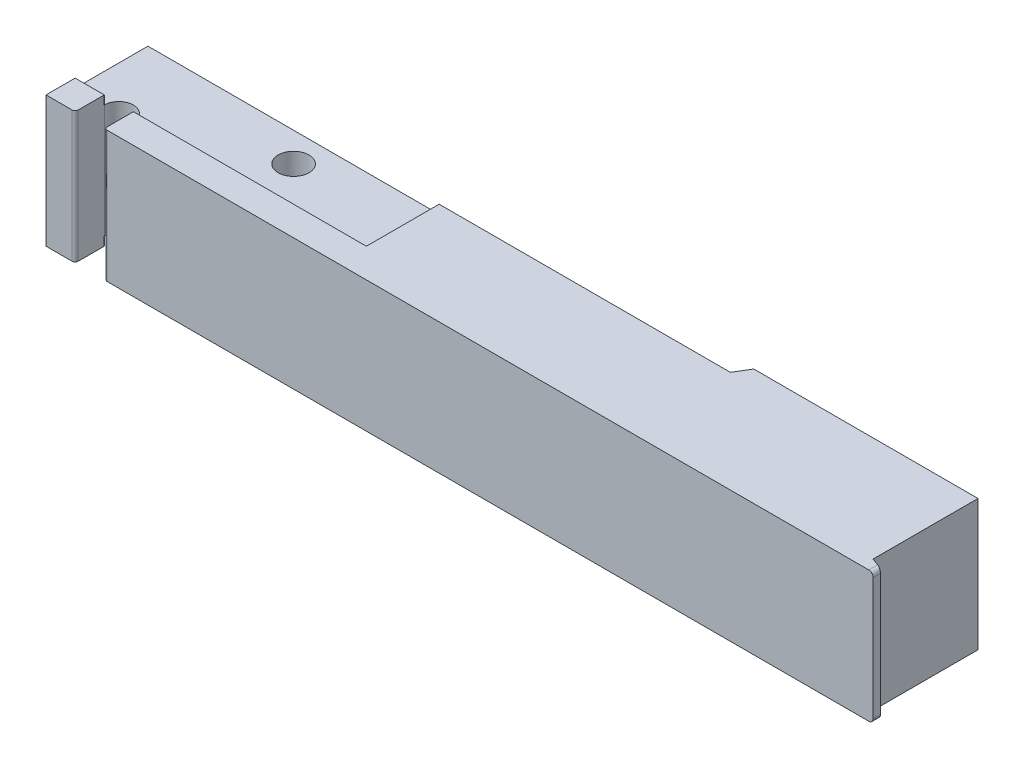
ISO-10303-21;
HEADER;
FILE_DESCRIPTION(('STEP AP214'),'2;1');
FILE_NAME('part.step','',(''),(''),'','','');
FILE_SCHEMA(('AUTOMOTIVE_DESIGN { 1 0 10303 214 1 1 1 1 }'));
ENDSEC;
DATA;
#1=APPLICATION_CONTEXT('core data for automotive mechanical design processes');
#2=APPLICATION_PROTOCOL_DEFINITION('international standard','automotive_design',2000,#1);
#3=PRODUCT_CONTEXT('',#1,'mechanical');
#4=PRODUCT('Part','Part','',(#3));
#5=PRODUCT_RELATED_PRODUCT_CATEGORY('part','',(#4));
#6=PRODUCT_DEFINITION_FORMATION('','',#4);
#7=PRODUCT_DEFINITION_CONTEXT('part definition',#1,'design');
#8=PRODUCT_DEFINITION('design','',#6,#7);
#9=PRODUCT_DEFINITION_SHAPE('','',#8);
#10=(LENGTH_UNIT() NAMED_UNIT(*) SI_UNIT(.MILLI.,.METRE.));
#11=(NAMED_UNIT(*) PLANE_ANGLE_UNIT() SI_UNIT($,.RADIAN.));
#12=(NAMED_UNIT(*) SI_UNIT($,.STERADIAN.) SOLID_ANGLE_UNIT());
#13=UNCERTAINTY_MEASURE_WITH_UNIT(LENGTH_MEASURE(1.E-05),#10,'distance_accuracy_value','');
#14=(GEOMETRIC_REPRESENTATION_CONTEXT(3) GLOBAL_UNCERTAINTY_ASSIGNED_CONTEXT((#13)) GLOBAL_UNIT_ASSIGNED_CONTEXT((#10,
#11,#12)) REPRESENTATION_CONTEXT('',''));
#15=CARTESIAN_POINT('',(0.,0.,0.));
#16=DIRECTION('',(0.,0.,1.));
#17=DIRECTION('',(1.,0.,0.));
#18=AXIS2_PLACEMENT_3D('',#15,#16,#17);
#19=CARTESIAN_POINT('',(12.6823074173348,-18.3135783689384,27.2138309190122));
#20=DIRECTION('',(0.,1.,0.));
#21=DIRECTION('',(-1.,0.,0.));
#22=AXIS2_PLACEMENT_3D('',#19,#20,#21);
#23=CYLINDRICAL_SURFACE('',#22,2.65);
#24=CARTESIAN_POINT('',(12.6823074173348,2.68742163106165,27.2138309190122));
#25=DIRECTION('',(0.,1.,0.));
#26=DIRECTION('',(-1.,0.,0.));
#27=AXIS2_PLACEMENT_3D('',#24,#25,#26);
#28=CIRCLE('',#27,2.65);
#29=CARTESIAN_POINT('',(10.0323074173348,2.68742163106165,27.2138309190122));
#30=VERTEX_POINT('',#29);
#31=EDGE_CURVE('E642',#30,#30,#28,.F.);
#32=ORIENTED_EDGE('',*,*,#31,.F.);
#33=EDGE_LOOP('',(#32));
#34=FACE_BOUND('',#33,.T.);
#35=CARTESIAN_POINT('',(12.6823074173348,-16.8125783689383,27.2138309190122));
#36=DIRECTION('',(0.,-1.,0.));
#37=DIRECTION('',(1.,0.,0.));
#38=AXIS2_PLACEMENT_3D('',#35,#36,#37);
#39=CIRCLE('',#38,2.65);
#40=CARTESIAN_POINT('',(15.3323074173348,-16.8125783689383,27.2138309190122));
#41=VERTEX_POINT('',#40);
#42=EDGE_CURVE('E681',#41,#41,#39,.F.);
#43=ORIENTED_EDGE('',*,*,#42,.F.);
#44=EDGE_LOOP('',(#43));
#45=FACE_BOUND('',#44,.T.);
#46=ADVANCED_FACE('F50',(#34,#45),#23,.F.);
#47=CARTESIAN_POINT('',(-9.81769258266516,-18.3135783689384,34.7138309190122));
#48=DIRECTION('',(0.,1.,0.));
#49=DIRECTION('',(-1.,0.,0.));
#50=AXIS2_PLACEMENT_3D('',#47,#48,#49);
#51=CYLINDRICAL_SURFACE('',#50,2.5);
#52=CARTESIAN_POINT('',(-9.81769258266516,-16.8125783689383,34.7138309190122));
#53=DIRECTION('',(0.,-1.,0.));
#54=DIRECTION('',(1.,0.,0.));
#55=AXIS2_PLACEMENT_3D('',#52,#53,#54);
#56=CIRCLE('',#55,2.5);
#57=CARTESIAN_POINT('',(-7.31769258266516,-16.8125783689383,34.7138309190122));
#58=VERTEX_POINT('',#57);
#59=CARTESIAN_POINT('',(-12.3176925826652,-16.8125783689383,34.7138309190122));
#60=VERTEX_POINT('',#59);
#61=EDGE_CURVE('E673',#58,#60,#56,.F.);
#62=ORIENTED_EDGE('',*,*,#61,.F.);
#63=DIRECTION('',(0.,1.,0.));
#64=VECTOR('',#63,1.);
#65=CARTESIAN_POINT('',(-7.31769258266516,-18.3135783689384,34.7138309190122));
#66=LINE('',#65,#64);
#67=CARTESIAN_POINT('',(-7.31769258266517,2.68742163106165,34.7138309190122));
#68=VERTEX_POINT('',#67);
#69=EDGE_CURVE('E66',#58,#68,#66,.T.);
#70=ORIENTED_EDGE('',*,*,#69,.T.);
#71=CARTESIAN_POINT('',(-9.81769258266516,2.68742163106165,34.7138309190122));
#72=DIRECTION('',(0.,1.,0.));
#73=DIRECTION('',(-1.,0.,0.));
#74=AXIS2_PLACEMENT_3D('',#71,#72,#73);
#75=CIRCLE('',#74,2.5);
#76=CARTESIAN_POINT('',(-12.3176925826652,2.68742163106165,34.7138309190122));
#77=VERTEX_POINT('',#76);
#78=EDGE_CURVE('E11',#77,#68,#75,.F.);
#79=ORIENTED_EDGE('',*,*,#78,.F.);
#80=DIRECTION('',(0.,1.,0.));
#81=VECTOR('',#80,1.);
#82=CARTESIAN_POINT('',(-12.3176925826652,-18.3135783689384,34.7138309190122));
#83=LINE('',#82,#81);
#84=EDGE_CURVE('E423',#60,#77,#83,.T.);
#85=ORIENTED_EDGE('',*,*,#84,.F.);
#86=EDGE_LOOP('',(#62,#70,#79,#85));
#87=FACE_BOUND('',#86,.T.);
#88=ADVANCED_FACE('F480',(#87),#51,.F.);
#89=CARTESIAN_POINT('',(-17.3176925826652,-18.3125783689383,19.7138309190122));
#90=DIRECTION('',(0.,-1.,0.));
#91=DIRECTION('',(1.,0.,0.));
#92=AXIS2_PLACEMENT_3D('',#89,#90,#91);
#93=PLANE('',#92);
#94=DIRECTION('',(0.,0.,1.));
#95=VECTOR('',#94,1.);
#96=CARTESIAN_POINT('',(-17.3176925826652,-18.3125783689383,19.7138309190122));
#97=LINE('',#96,#95);
#98=CARTESIAN_POINT('',(-17.3176925826652,-18.3125783689383,34.7138309190122));
#99=VERTEX_POINT('',#98);
#100=CARTESIAN_POINT('',(-17.3176925826652,-18.3125783689383,39.7138309190122));
#101=VERTEX_POINT('',#100);
#102=EDGE_CURVE('E286',#99,#101,#97,.T.);
#103=ORIENTED_EDGE('',*,*,#102,.F.);
#104=DIRECTION('',(1.,0.,0.));
#105=VECTOR('',#104,1.);
#106=CARTESIAN_POINT('',(-17.3176925826652,-18.3125783689383,34.7138309190122));
#107=LINE('',#106,#105);
#108=CARTESIAN_POINT('',(-12.3176925826652,-18.3125783689383,34.7138309190122));
#109=VERTEX_POINT('',#108);
#110=EDGE_CURVE('E228',#99,#109,#107,.T.);
#111=ORIENTED_EDGE('',*,*,#110,.T.);
#112=DIRECTION('',(0.,0.,-1.));
#113=VECTOR('',#112,1.);
#114=CARTESIAN_POINT('',(-12.3176925826652,-18.3125783689383,39.7138309190122));
#115=LINE('',#114,#113);
#116=CARTESIAN_POINT('',(-12.3176925826652,-18.3125783689383,39.2138309190122));
#117=VERTEX_POINT('',#116);
#118=EDGE_CURVE('E418',#117,#109,#115,.T.);
#119=ORIENTED_EDGE('',*,*,#118,.F.);
#120=CARTESIAN_POINT('',(-12.8176925826652,-18.3125783689383,39.2138309190122));
#121=DIRECTION('',(0.,-1.,0.));
#122=DIRECTION('',(1.,0.,0.));
#123=AXIS2_PLACEMENT_3D('',#120,#121,#122);
#124=CIRCLE('',#123,0.5);
#125=CARTESIAN_POINT('',(-12.8176925826652,-18.3125783689383,39.7138309190122));
#126=VERTEX_POINT('',#125);
#127=EDGE_CURVE('E369',#117,#126,#124,.T.);
#128=ORIENTED_EDGE('',*,*,#127,.T.);
#129=DIRECTION('',(1.,0.,0.));
#130=VECTOR('',#129,1.);
#131=CARTESIAN_POINT('',(-17.3176925826652,-18.3125783689383,39.7138309190122));
#132=LINE('',#131,#130);
#133=EDGE_CURVE('E283',#101,#126,#132,.T.);
#134=ORIENTED_EDGE('',*,*,#133,.F.);
#135=EDGE_LOOP('',(#103,#111,#119,#128,#134));
#136=FACE_BOUND('',#135,.T.);
#137=ADVANCED_FACE('F487',(#136),#93,.T.);
#138=DIRECTION('',(0.,0.,-1.));
#139=VECTOR('',#138,1.);
#140=CARTESIAN_POINT('',(-7.31769258266516,-18.3125783689383,39.7138309190122));
#141=LINE('',#140,#139);
#142=CARTESIAN_POINT('',(-7.31769258266516,-18.3125783689383,39.2138309190122));
#143=VERTEX_POINT('',#142);
#144=CARTESIAN_POINT('',(-7.31769258266516,-18.3125783689383,34.7138309190122));
#145=VERTEX_POINT('',#144);
#146=EDGE_CURVE('E404',#143,#145,#141,.T.);
#147=ORIENTED_EDGE('',*,*,#146,.T.);
#148=CARTESIAN_POINT('',(32.6823074173348,-18.3125783689383,34.7138309190122));
#149=VERTEX_POINT('',#148);
#150=EDGE_CURVE('E662',#145,#149,#107,.T.);
#151=ORIENTED_EDGE('',*,*,#150,.T.);
#152=DIRECTION('',(0.,0.,-1.));
#153=VECTOR('',#152,1.);
#154=CARTESIAN_POINT('',(32.6823074173348,-18.3125783689383,22.2138309190122));
#155=LINE('',#154,#153);
#156=CARTESIAN_POINT('',(32.6823074173348,-18.3125783689383,22.2138309190122));
#157=VERTEX_POINT('',#156);
#158=EDGE_CURVE('E666',#149,#157,#155,.T.);
#159=ORIENTED_EDGE('',*,*,#158,.T.);
#160=DIRECTION('',(1.,0.,0.));
#161=VECTOR('',#160,1.);
#162=CARTESIAN_POINT('',(82.6823074173348,-18.3125783689384,22.2138309190122));
#163=LINE('',#162,#161);
#164=CARTESIAN_POINT('',(82.6823074173348,-18.3125783689384,22.2138309190122));
#165=VERTEX_POINT('',#164);
#166=EDGE_CURVE('E435',#157,#165,#163,.T.);
#167=ORIENTED_EDGE('',*,*,#166,.T.);
#168=DIRECTION('',(0.514495755427527,0.,-0.857492925712544));
#169=VECTOR('',#168,1.);
#170=CARTESIAN_POINT('',(82.6823074173348,-18.3125783689384,22.2138309190122));
#171=LINE('',#170,#169);
#172=CARTESIAN_POINT('',(84.1823074173348,-18.3125783689384,19.7138309190122));
#173=VERTEX_POINT('',#172);
#174=EDGE_CURVE('E258',#165,#173,#171,.T.);
#175=ORIENTED_EDGE('',*,*,#174,.T.);
#176=DIRECTION('',(1.,0.,0.));
#177=VECTOR('',#176,1.);
#178=CARTESIAN_POINT('',(-17.3176925826652,-18.3125783689383,19.7138309190122));
#179=LINE('',#178,#177);
#180=CARTESIAN_POINT('',(122.682307417335,-18.3125783689383,19.7138309190122));
#181=VERTEX_POINT('',#180);
#182=EDGE_CURVE('E282',#173,#181,#179,.T.);
#183=ORIENTED_EDGE('',*,*,#182,.T.);
#184=DIRECTION('',(0.,0.,1.));
#185=VECTOR('',#184,1.);
#186=CARTESIAN_POINT('',(122.682307417335,-18.3125783689383,19.7138309190122));
#187=LINE('',#186,#185);
#188=CARTESIAN_POINT('',(122.682307417335,-18.3125783689383,37.7358904504798));
#189=VERTEX_POINT('',#188);
#190=EDGE_CURVE('E267',#181,#189,#187,.T.);
#191=ORIENTED_EDGE('',*,*,#190,.T.);
#192=DIRECTION('',(-0.939692620785909,0.,-0.342020143325667));
#193=VECTOR('',#192,1.);
#194=CARTESIAN_POINT('',(-6.73298188492406,-18.3125783689383,-9.3674227144914));
#195=LINE('',#194,#193);
#196=CARTESIAN_POINT('',(123.932307417335,-18.3125783689383,38.1908532433126));
#197=VERTEX_POINT('',#196);
#198=EDGE_CURVE('E315',#189,#197,#195,.F.);
#199=ORIENTED_EDGE('',*,*,#198,.T.);
#200=DIRECTION('',(0.,0.,1.));
#201=VECTOR('',#200,1.);
#202=CARTESIAN_POINT('',(123.932307417335,-18.3125783689383,19.7138309190122));
#203=LINE('',#202,#201);
#204=CARTESIAN_POINT('',(123.932307417335,-18.3125783689383,39.7138309190122));
#205=VERTEX_POINT('',#204);
#206=EDGE_CURVE('E323',#197,#205,#203,.T.);
#207=ORIENTED_EDGE('',*,*,#206,.T.);
#208=CARTESIAN_POINT('',(-6.81769258266516,-18.3125783689383,39.7138309190122));
#209=VERTEX_POINT('',#208);
#210=EDGE_CURVE('E299',#209,#205,#132,.T.);
#211=ORIENTED_EDGE('',*,*,#210,.F.);
#212=CARTESIAN_POINT('',(-6.81769258266516,-18.3125783689383,39.2138309190122));
#213=DIRECTION('',(0.,-1.,0.));
#214=DIRECTION('',(1.,0.,0.));
#215=AXIS2_PLACEMENT_3D('',#212,#213,#214);
#216=CIRCLE('',#215,0.5);
#217=EDGE_CURVE('E366',#209,#143,#216,.T.);
#218=ORIENTED_EDGE('',*,*,#217,.T.);
#219=EDGE_LOOP('',(#147,#151,#159,#167,#175,#183,#191,#199,#207,#211,#218));
#220=FACE_BOUND('',#219,.T.);
#221=ADVANCED_FACE('F393',(#220),#93,.T.);
#222=CARTESIAN_POINT('',(-17.3176925826652,-18.3125783689383,19.7138309190122));
#223=DIRECTION('',(1.,0.,0.));
#224=DIRECTION('',(0.,0.,-1.));
#225=AXIS2_PLACEMENT_3D('',#222,#223,#224);
#226=PLANE('',#225);
#227=DIRECTION('',(0.,-1.,0.));
#228=VECTOR('',#227,1.);
#229=CARTESIAN_POINT('',(-17.3176925826652,-16.8125783689383,34.7138309190122));
#230=LINE('',#229,#228);
#231=CARTESIAN_POINT('',(-17.3176925826652,-16.8125783689383,34.7138309190122));
#232=VERTEX_POINT('',#231);
#233=EDGE_CURVE('E670',#232,#99,#230,.T.);
#234=ORIENTED_EDGE('',*,*,#233,.T.);
#235=ORIENTED_EDGE('',*,*,#102,.T.);
#236=DIRECTION('',(0.,1.,0.));
#237=VECTOR('',#236,1.);
#238=CARTESIAN_POINT('',(-17.3176925826652,-18.3125783689383,39.7138309190122));
#239=LINE('',#238,#237);
#240=CARTESIAN_POINT('',(-17.3176925826652,4.18742163106165,39.7138309190122));
#241=VERTEX_POINT('',#240);
#242=EDGE_CURVE('E278',#101,#241,#239,.T.);
#243=ORIENTED_EDGE('',*,*,#242,.T.);
#244=DIRECTION('',(0.,0.,1.));
#245=VECTOR('',#244,1.);
#246=CARTESIAN_POINT('',(-17.3176925826652,4.18742163106165,19.7138309190122));
#247=LINE('',#246,#245);
#248=CARTESIAN_POINT('',(-17.3176925826652,4.18742163106165,34.7138309190122));
#249=VERTEX_POINT('',#248);
#250=EDGE_CURVE('E305',#249,#241,#247,.T.);
#251=ORIENTED_EDGE('',*,*,#250,.F.);
#252=DIRECTION('',(0.,1.,0.));
#253=VECTOR('',#252,1.);
#254=CARTESIAN_POINT('',(-17.3176925826652,2.68742163106165,34.7138309190122));
#255=LINE('',#254,#253);
#256=CARTESIAN_POINT('',(-17.3176925826652,2.68742163106165,34.7138309190122));
#257=VERTEX_POINT('',#256);
#258=EDGE_CURVE('E653',#257,#249,#255,.T.);
#259=ORIENTED_EDGE('',*,*,#258,.F.);
#260=DIRECTION('',(0.,0.,1.));
#261=VECTOR('',#260,1.);
#262=CARTESIAN_POINT('',(-17.3176925826652,2.68742163106165,22.2138309190122));
#263=LINE('',#262,#261);
#264=CARTESIAN_POINT('',(-17.3176925826652,2.68742163106165,22.2138309190122));
#265=VERTEX_POINT('',#264);
#266=EDGE_CURVE('E244',#265,#257,#263,.T.);
#267=ORIENTED_EDGE('',*,*,#266,.F.);
#268=DIRECTION('',(0.,1.,0.));
#269=VECTOR('',#268,1.);
#270=CARTESIAN_POINT('',(-17.3176925826652,-18.3125783689384,22.2138309190122));
#271=LINE('',#270,#269);
#272=CARTESIAN_POINT('',(-17.3176925826652,-16.8125783689383,22.2138309190122));
#273=VERTEX_POINT('',#272);
#274=EDGE_CURVE('E233',#273,#265,#271,.T.);
#275=ORIENTED_EDGE('',*,*,#274,.F.);
#276=DIRECTION('',(0.,0.,1.));
#277=VECTOR('',#276,1.);
#278=CARTESIAN_POINT('',(-17.3176925826652,-16.8125783689383,22.2138309190122));
#279=LINE('',#278,#277);
#280=EDGE_CURVE('E214',#273,#232,#279,.T.);
#281=ORIENTED_EDGE('',*,*,#280,.T.);
#282=EDGE_LOOP('',(#234,#235,#243,#251,#259,#267,#275,#281));
#283=FACE_BOUND('',#282,.T.);
#284=ADVANCED_FACE('F241',(#283),#226,.F.);
#285=CARTESIAN_POINT('',(82.6823074173348,-18.3125783689384,22.2138309190122));
#286=DIRECTION('',(0.,0.,1.));
#287=DIRECTION('',(1.,0.,0.));
#288=AXIS2_PLACEMENT_3D('',#285,#286,#287);
#289=PLANE('',#288);
#290=DIRECTION('',(0.,-1.,0.));
#291=VECTOR('',#290,1.);
#292=CARTESIAN_POINT('',(32.6823074173348,-16.8125783689383,22.2138309190122));
#293=LINE('',#292,#291);
#294=CARTESIAN_POINT('',(32.6823074173348,-16.8125783689383,22.2138309190122));
#295=VERTEX_POINT('',#294);
#296=EDGE_CURVE('E236',#295,#157,#293,.T.);
#297=ORIENTED_EDGE('',*,*,#296,.F.);
#298=DIRECTION('',(-1.,0.,0.));
#299=VECTOR('',#298,1.);
#300=CARTESIAN_POINT('',(-17.3176925826652,-16.8125783689383,22.2138309190122));
#301=LINE('',#300,#299);
#302=EDGE_CURVE('E219',#295,#273,#301,.T.);
#303=ORIENTED_EDGE('',*,*,#302,.T.);
#304=ORIENTED_EDGE('',*,*,#274,.T.);
#305=DIRECTION('',(-1.,0.,0.));
#306=VECTOR('',#305,1.);
#307=CARTESIAN_POINT('',(-17.3176925826652,2.68742163106165,22.2138309190122));
#308=LINE('',#307,#306);
#309=CARTESIAN_POINT('',(32.6823074173348,2.68742163106166,22.2138309190122));
#310=VERTEX_POINT('',#309);
#311=EDGE_CURVE('E696',#310,#265,#308,.T.);
#312=ORIENTED_EDGE('',*,*,#311,.F.);
#313=DIRECTION('',(0.,1.,0.));
#314=VECTOR('',#313,1.);
#315=CARTESIAN_POINT('',(32.6823074173348,2.68742163106166,22.2138309190122));
#316=LINE('',#315,#314);
#317=CARTESIAN_POINT('',(32.6823074173348,4.18742163106166,22.2138309190122));
#318=VERTEX_POINT('',#317);
#319=EDGE_CURVE('E643',#310,#318,#316,.T.);
#320=ORIENTED_EDGE('',*,*,#319,.T.);
#321=DIRECTION('',(-1.,0.,0.));
#322=VECTOR('',#321,1.);
#323=CARTESIAN_POINT('',(-17.3176925826652,4.18742163106165,22.2138309190122));
#324=LINE('',#323,#322);
#325=CARTESIAN_POINT('',(82.6823074173348,4.18742163106166,22.2138309190122));
#326=VERTEX_POINT('',#325);
#327=EDGE_CURVE('E252',#326,#318,#324,.T.);
#328=ORIENTED_EDGE('',*,*,#327,.F.);
#329=DIRECTION('',(0.,1.,0.));
#330=VECTOR('',#329,1.);
#331=CARTESIAN_POINT('',(82.6823074173348,-18.3125783689384,22.2138309190122));
#332=LINE('',#331,#330);
#333=EDGE_CURVE('E255',#165,#326,#332,.T.);
#334=ORIENTED_EDGE('',*,*,#333,.F.);
#335=ORIENTED_EDGE('',*,*,#166,.F.);
#336=EDGE_LOOP('',(#297,#303,#304,#312,#320,#328,#334,#335));
#337=FACE_BOUND('',#336,.T.);
#338=ADVANCED_FACE('F231',(#337),#289,.F.);
#339=CARTESIAN_POINT('',(-17.3176925826652,4.18742163106165,19.7138309190122));
#340=DIRECTION('',(0.,-1.,0.));
#341=DIRECTION('',(1.,0.,0.));
#342=AXIS2_PLACEMENT_3D('',#339,#340,#341);
#343=PLANE('',#342);
#344=ORIENTED_EDGE('',*,*,#327,.T.);
#345=DIRECTION('',(0.,0.,-1.));
#346=VECTOR('',#345,1.);
#347=CARTESIAN_POINT('',(32.6823074173348,4.18742163106166,22.2138309190122));
#348=LINE('',#347,#346);
#349=CARTESIAN_POINT('',(32.6823074173348,4.18742163106166,34.7138309190122));
#350=VERTEX_POINT('',#349);
#351=EDGE_CURVE('E688',#350,#318,#348,.T.);
#352=ORIENTED_EDGE('',*,*,#351,.F.);
#353=DIRECTION('',(1.,0.,0.));
#354=VECTOR('',#353,1.);
#355=CARTESIAN_POINT('',(-17.3176925826652,4.18742163106165,34.7138309190122));
#356=LINE('',#355,#354);
#357=CARTESIAN_POINT('',(-7.31769258266517,4.18742163106165,34.7138309190122));
#358=VERTEX_POINT('',#357);
#359=EDGE_CURVE('E408',#358,#350,#356,.T.);
#360=ORIENTED_EDGE('',*,*,#359,.F.);
#361=DIRECTION('',(0.,0.,-1.));
#362=VECTOR('',#361,1.);
#363=CARTESIAN_POINT('',(-7.31769258266517,4.18742163106165,39.7138309190122));
#364=LINE('',#363,#362);
#365=CARTESIAN_POINT('',(-7.31769258266517,4.18742163106165,39.2138309190122));
#366=VERTEX_POINT('',#365);
#367=EDGE_CURVE('E402',#366,#358,#364,.T.);
#368=ORIENTED_EDGE('',*,*,#367,.F.);
#369=CARTESIAN_POINT('',(-6.81769258266516,4.18742163106165,39.2138309190122));
#370=DIRECTION('',(0.,-1.,0.));
#371=DIRECTION('',(1.,0.,0.));
#372=AXIS2_PLACEMENT_3D('',#369,#370,#371);
#373=CIRCLE('',#372,0.5);
#374=CARTESIAN_POINT('',(-6.81769258266516,4.18742163106165,39.7138309190122));
#375=VERTEX_POINT('',#374);
#376=EDGE_CURVE('E74',#366,#375,#373,.F.);
#377=ORIENTED_EDGE('',*,*,#376,.T.);
#378=DIRECTION('',(1.,0.,0.));
#379=VECTOR('',#378,1.);
#380=CARTESIAN_POINT('',(-17.3176925826652,4.18742163106165,39.7138309190122));
#381=LINE('',#380,#379);
#382=CARTESIAN_POINT('',(123.932307417335,4.18742163106167,39.7138309190122));
#383=VERTEX_POINT('',#382);
#384=EDGE_CURVE('E290',#375,#383,#381,.T.);
#385=ORIENTED_EDGE('',*,*,#384,.T.);
#386=DIRECTION('',(0.,0.,1.));
#387=VECTOR('',#386,1.);
#388=CARTESIAN_POINT('',(123.932307417335,4.18742163106167,38.4638309190122));
#389=LINE('',#388,#387);
#390=CARTESIAN_POINT('',(123.932307417335,4.18742163106167,38.1908532433126));
#391=VERTEX_POINT('',#390);
#392=EDGE_CURVE('E347',#383,#391,#389,.F.);
#393=ORIENTED_EDGE('',*,*,#392,.T.);
#394=DIRECTION('',(0.939692620785909,0.,0.342020143325667));
#395=VECTOR('',#394,1.);
#396=CARTESIAN_POINT('',(124.682307417335,4.18742163106167,38.4638309190122));
#397=LINE('',#396,#395);
#398=CARTESIAN_POINT('',(122.682307417335,4.18742163106167,37.7358904504798));
#399=VERTEX_POINT('',#398);
#400=EDGE_CURVE('E312',#391,#399,#397,.F.);
#401=ORIENTED_EDGE('',*,*,#400,.T.);
#402=DIRECTION('',(0.,0.,1.));
#403=VECTOR('',#402,1.);
#404=CARTESIAN_POINT('',(122.682307417335,4.18742163106167,19.7138309190122));
#405=LINE('',#404,#403);
#406=CARTESIAN_POINT('',(122.682307417335,4.18742163106167,19.7138309190122));
#407=VERTEX_POINT('',#406);
#408=EDGE_CURVE('E270',#407,#399,#405,.T.);
#409=ORIENTED_EDGE('',*,*,#408,.F.);
#410=DIRECTION('',(1.,0.,0.));
#411=VECTOR('',#410,1.);
#412=CARTESIAN_POINT('',(-17.3176925826652,4.18742163106165,19.7138309190122));
#413=LINE('',#412,#411);
#414=CARTESIAN_POINT('',(84.1823074173348,4.18742163106166,19.7138309190122));
#415=VERTEX_POINT('',#414);
#416=EDGE_CURVE('E279',#415,#407,#413,.T.);
#417=ORIENTED_EDGE('',*,*,#416,.F.);
#418=DIRECTION('',(-0.514495755427527,0.,0.857492925712544));
#419=VECTOR('',#418,1.);
#420=CARTESIAN_POINT('',(57.3146603585113,4.18742163106166,64.4932426837181));
#421=LINE('',#420,#419);
#422=EDGE_CURVE('E246',#415,#326,#421,.T.);
#423=ORIENTED_EDGE('',*,*,#422,.T.);
#424=EDGE_LOOP('',(#344,#352,#360,#368,#377,#385,#393,#401,#409,#417,#423));
#425=FACE_BOUND('',#424,.T.);
#426=ADVANCED_FACE('F406',(#425),#343,.F.);
#427=DIRECTION('',(0.,0.,-1.));
#428=VECTOR('',#427,1.);
#429=CARTESIAN_POINT('',(-12.3176925826652,4.18742163106165,39.7138309190122));
#430=LINE('',#429,#428);
#431=CARTESIAN_POINT('',(-12.3176925826652,4.18742163106165,39.2138309190122));
#432=VERTEX_POINT('',#431);
#433=CARTESIAN_POINT('',(-12.3176925826652,4.18742163106165,34.7138309190122));
#434=VERTEX_POINT('',#433);
#435=EDGE_CURVE('E411',#432,#434,#430,.T.);
#436=ORIENTED_EDGE('',*,*,#435,.T.);
#437=EDGE_CURVE('E699',#249,#434,#356,.T.);
#438=ORIENTED_EDGE('',*,*,#437,.F.);
#439=ORIENTED_EDGE('',*,*,#250,.T.);
#440=CARTESIAN_POINT('',(-12.8176925826652,4.18742163106165,39.7138309190122));
#441=VERTEX_POINT('',#440);
#442=EDGE_CURVE('E291',#241,#441,#381,.T.);
#443=ORIENTED_EDGE('',*,*,#442,.T.);
#444=CARTESIAN_POINT('',(-12.8176925826652,4.18742163106165,39.2138309190122));
#445=DIRECTION('',(0.,-1.,0.));
#446=DIRECTION('',(1.,0.,0.));
#447=AXIS2_PLACEMENT_3D('',#444,#445,#446);
#448=CIRCLE('',#447,0.5);
#449=EDGE_CURVE('E377',#441,#432,#448,.F.);
#450=ORIENTED_EDGE('',*,*,#449,.T.);
#451=EDGE_LOOP('',(#436,#438,#439,#443,#450));
#452=FACE_BOUND('',#451,.T.);
#453=ADVANCED_FACE('F513',(#452),#343,.F.);
#454=CARTESIAN_POINT('',(-17.3176925826652,-18.3125783689383,39.7138309190122));
#455=DIRECTION('',(0.,0.,-1.));
#456=DIRECTION('',(-1.,0.,0.));
#457=AXIS2_PLACEMENT_3D('',#454,#455,#456);
#458=PLANE('',#457);
#459=ORIENTED_EDGE('',*,*,#133,.T.);
#460=DIRECTION('',(0.,-1.,0.));
#461=VECTOR('',#460,1.);
#462=CARTESIAN_POINT('',(-12.8176925826652,4.18742163106165,39.7138309190122));
#463=LINE('',#462,#461);
#464=EDGE_CURVE('E372',#126,#441,#463,.F.);
#465=ORIENTED_EDGE('',*,*,#464,.T.);
#466=ORIENTED_EDGE('',*,*,#442,.F.);
#467=ORIENTED_EDGE('',*,*,#242,.F.);
#468=EDGE_LOOP('',(#459,#465,#466,#467));
#469=FACE_BOUND('',#468,.T.);
#470=ADVANCED_FACE('F507',(#469),#458,.F.);
#471=CARTESIAN_POINT('',(109.182307417335,-7.06257836893835,24.7138309190122));
#472=DIRECTION('',(0.,0.,-1.));
#473=DIRECTION('',(-1.,0.,0.));
#474=AXIS2_PLACEMENT_3D('',#471,#472,#473);
#475=CYLINDRICAL_SURFACE('',#474,2.99999999999999);
#476=CARTESIAN_POINT('',(109.182307417335,-7.06257836893835,19.7138309190122));
#477=DIRECTION('',(0.,0.,-1.));
#478=DIRECTION('',(-1.,0.,0.));
#479=AXIS2_PLACEMENT_3D('',#476,#477,#478);
#480=CIRCLE('',#479,2.99999999999999);
#481=CARTESIAN_POINT('',(106.182307417335,-7.06257836893835,19.7138309190122));
#482=VERTEX_POINT('',#481);
#483=EDGE_CURVE('E432',#482,#482,#480,.T.);
#484=ORIENTED_EDGE('',*,*,#483,.T.);
#485=EDGE_LOOP('',(#484));
#486=FACE_BOUND('',#485,.T.);
#487=CARTESIAN_POINT('',(109.182307417335,-7.06257836893835,23.7138309190122));
#488=DIRECTION('',(0.,0.,-1.));
#489=DIRECTION('',(-1.,0.,0.));
#490=AXIS2_PLACEMENT_3D('',#487,#488,#489);
#491=CIRCLE('',#490,2.99999999999999);
#492=CARTESIAN_POINT('',(106.182307417335,-7.06257836893835,23.7138309190122));
#493=VERTEX_POINT('',#492);
#494=EDGE_CURVE('E350',#493,#493,#491,.T.);
#495=ORIENTED_EDGE('',*,*,#494,.F.);
#496=EDGE_LOOP('',(#495));
#497=FACE_BOUND('',#496,.T.);
#498=ADVANCED_FACE('F493',(#486,#497),#475,.F.);
#499=CARTESIAN_POINT('',(124.682307417335,-18.3125783689383,19.7138309190122));
#500=DIRECTION('',(1.,0.,0.));
#501=DIRECTION('',(0.,0.,-1.));
#502=AXIS2_PLACEMENT_3D('',#499,#500,#501);
#503=PLANE('',#502);
#504=DIRECTION('',(0.,1.,0.));
#505=VECTOR('',#504,1.);
#506=CARTESIAN_POINT('',(124.682307417335,-18.3125783689383,39.7138309190122));
#507=LINE('',#506,#505);
#508=CARTESIAN_POINT('',(124.682307417335,-17.5625783689383,39.7138309190122));
#509=VERTEX_POINT('',#508);
#510=CARTESIAN_POINT('',(124.682307417335,3.43742163106166,39.7138309190122));
#511=VERTEX_POINT('',#510);
#512=EDGE_CURVE('E295',#509,#511,#507,.T.);
#513=ORIENTED_EDGE('',*,*,#512,.F.);
#514=DIRECTION('',(0.,0.,1.));
#515=VECTOR('',#514,1.);
#516=CARTESIAN_POINT('',(124.682307417335,-17.5625783689383,19.7138309190122));
#517=LINE('',#516,#515);
#518=CARTESIAN_POINT('',(124.682307417335,-17.5625783689383,38.4638309190122));
#519=VERTEX_POINT('',#518);
#520=EDGE_CURVE('E338',#509,#519,#517,.F.);
#521=ORIENTED_EDGE('',*,*,#520,.T.);
#522=DIRECTION('',(0.,1.,0.));
#523=VECTOR('',#522,1.);
#524=CARTESIAN_POINT('',(124.682307417335,-18.3125783689383,38.4638309190122));
#525=LINE('',#524,#523);
#526=CARTESIAN_POINT('',(124.682307417335,3.43742163106167,38.4638309190122));
#527=VERTEX_POINT('',#526);
#528=EDGE_CURVE('E308',#519,#527,#525,.T.);
#529=ORIENTED_EDGE('',*,*,#528,.T.);
#530=DIRECTION('',(0.,0.,1.));
#531=VECTOR('',#530,1.);
#532=CARTESIAN_POINT('',(124.682307417335,3.43742163106167,39.7138309190122));
#533=LINE('',#532,#531);
#534=EDGE_CURVE('E334',#527,#511,#533,.T.);
#535=ORIENTED_EDGE('',*,*,#534,.T.);
#536=EDGE_LOOP('',(#513,#521,#529,#535));
#537=FACE_BOUND('',#536,.T.);
#538=ADVANCED_FACE('F465',(#537),#503,.T.);
#539=CARTESIAN_POINT('',(-17.3176925826652,-18.3125783689383,19.7138309190122));
#540=DIRECTION('',(0.,0.,-1.));
#541=DIRECTION('',(-1.,0.,0.));
#542=AXIS2_PLACEMENT_3D('',#539,#540,#541);
#543=PLANE('',#542);
#544=ORIENTED_EDGE('',*,*,#483,.F.);
#545=EDGE_LOOP('',(#544));
#546=FACE_BOUND('',#545,.T.);
#547=DIRECTION('',(0.,1.,0.));
#548=VECTOR('',#547,1.);
#549=CARTESIAN_POINT('',(84.1823074173348,-18.3125783689384,19.7138309190122));
#550=LINE('',#549,#548);
#551=EDGE_CURVE('E247',#173,#415,#550,.T.);
#552=ORIENTED_EDGE('',*,*,#551,.T.);
#553=ORIENTED_EDGE('',*,*,#416,.T.);
#554=DIRECTION('',(0.,1.,0.));
#555=VECTOR('',#554,1.);
#556=CARTESIAN_POINT('',(122.682307417335,-18.3125783689383,19.7138309190122));
#557=LINE('',#556,#555);
#558=EDGE_CURVE('E274',#181,#407,#557,.T.);
#559=ORIENTED_EDGE('',*,*,#558,.F.);
#560=ORIENTED_EDGE('',*,*,#182,.F.);
#561=EDGE_LOOP('',(#552,#553,#559,#560));
#562=FACE_BOUND('',#561,.T.);
#563=ADVANCED_FACE('F447',(#546,#562),#543,.T.);
#564=ORIENTED_EDGE('',*,*,#384,.F.);
#565=DIRECTION('',(0.,1.,0.));
#566=VECTOR('',#565,1.);
#567=CARTESIAN_POINT('',(-6.81769258266516,-18.3125783689383,39.7138309190122));
#568=LINE('',#567,#566);
#569=EDGE_CURVE('E59',#375,#209,#568,.F.);
#570=ORIENTED_EDGE('',*,*,#569,.T.);
#571=ORIENTED_EDGE('',*,*,#210,.T.);
#572=CARTESIAN_POINT('',(123.932307417335,-17.5625783689383,39.7138309190122));
#573=DIRECTION('',(0.,0.,-1.));
#574=DIRECTION('',(-1.,0.,0.));
#575=AXIS2_PLACEMENT_3D('',#572,#573,#574);
#576=CIRCLE('',#575,0.75);
#577=EDGE_CURVE('E331',#205,#509,#576,.F.);
#578=ORIENTED_EDGE('',*,*,#577,.T.);
#579=ORIENTED_EDGE('',*,*,#512,.T.);
#580=CARTESIAN_POINT('',(123.932307417335,3.43742163106167,39.7138309190122));
#581=DIRECTION('',(0.,0.,-1.));
#582=DIRECTION('',(-1.,0.,0.));
#583=AXIS2_PLACEMENT_3D('',#580,#581,#582);
#584=CIRCLE('',#583,0.75);
#585=EDGE_CURVE('E327',#511,#383,#584,.F.);
#586=ORIENTED_EDGE('',*,*,#585,.T.);
#587=EDGE_LOOP('',(#564,#570,#571,#578,#579,#586));
#588=FACE_BOUND('',#587,.T.);
#589=ADVANCED_FACE('F387',(#588),#458,.F.);
#590=CARTESIAN_POINT('',(122.682307417335,-18.3125783689383,39.7138309190122));
#591=DIRECTION('',(-1.,0.,0.));
#592=DIRECTION('',(0.,0.,1.));
#593=AXIS2_PLACEMENT_3D('',#590,#591,#592);
#594=PLANE('',#593);
#595=ORIENTED_EDGE('',*,*,#190,.F.);
#596=ORIENTED_EDGE('',*,*,#558,.T.);
#597=ORIENTED_EDGE('',*,*,#408,.T.);
#598=DIRECTION('',(0.,1.,0.));
#599=VECTOR('',#598,1.);
#600=CARTESIAN_POINT('',(122.682307417335,-18.3125783689383,37.7358904504798));
#601=LINE('',#600,#599);
#602=EDGE_CURVE('E319',#399,#189,#601,.F.);
#603=ORIENTED_EDGE('',*,*,#602,.T.);
#604=EDGE_LOOP('',(#595,#596,#597,#603));
#605=FACE_BOUND('',#604,.T.);
#606=ADVANCED_FACE('F451',(#605),#594,.F.);
#607=CARTESIAN_POINT('',(124.682307417335,-18.3125783689383,38.4638309190122));
#608=DIRECTION('',(-0.342020143325667,0.,0.939692620785909));
#609=DIRECTION('',(0.,1.,0.));
#610=AXIS2_PLACEMENT_3D('',#607,#608,#609);
#611=PLANE('',#610);
#612=ORIENTED_EDGE('',*,*,#528,.F.);
#613=CARTESIAN_POINT('',(123.932307417335,-17.5625783689383,38.1908532433126));
#614=DIRECTION('',(-0.342020143325667,0.,0.939692620785909));
#615=DIRECTION('',(0.939692620785909,0.,0.342020143325667));
#616=AXIS2_PLACEMENT_3D('',#613,#614,#615);
#617=ELLIPSE('',#616,0.798133329356934,0.75);
#618=EDGE_CURVE('E344',#519,#197,#617,.F.);
#619=ORIENTED_EDGE('',*,*,#618,.T.);
#620=ORIENTED_EDGE('',*,*,#198,.F.);
#621=ORIENTED_EDGE('',*,*,#602,.F.);
#622=ORIENTED_EDGE('',*,*,#400,.F.);
#623=CARTESIAN_POINT('',(123.932307417335,3.43742163106167,38.1908532433126));
#624=DIRECTION('',(-0.342020143325667,0.,0.939692620785909));
#625=DIRECTION('',(-0.939692620785909,0.,-0.342020143325667));
#626=AXIS2_PLACEMENT_3D('',#623,#624,#625);
#627=ELLIPSE('',#626,0.798133329356934,0.75);
#628=EDGE_CURVE('E341',#391,#527,#627,.F.);
#629=ORIENTED_EDGE('',*,*,#628,.T.);
#630=EDGE_LOOP('',(#612,#619,#620,#621,#622,#629));
#631=FACE_BOUND('',#630,.T.);
#632=ADVANCED_FACE('F458',(#631),#611,.F.);
#633=CARTESIAN_POINT('',(123.932307417335,-17.5625783689383,19.7138309190122));
#634=DIRECTION('',(0.,0.,1.));
#635=DIRECTION('',(1.,0.,0.));
#636=AXIS2_PLACEMENT_3D('',#633,#634,#635);
#637=CYLINDRICAL_SURFACE('',#636,0.75);
#638=ORIENTED_EDGE('',*,*,#618,.F.);
#639=ORIENTED_EDGE('',*,*,#520,.F.);
#640=ORIENTED_EDGE('',*,*,#577,.F.);
#641=ORIENTED_EDGE('',*,*,#206,.F.);
#642=EDGE_LOOP('',(#638,#639,#640,#641));
#643=FACE_BOUND('',#642,.T.);
#644=ADVANCED_FACE('F469',(#643),#637,.T.);
#645=CARTESIAN_POINT('',(123.932307417335,3.43742163106167,19.7138309190122));
#646=DIRECTION('',(0.,0.,-1.));
#647=DIRECTION('',(-1.,0.,0.));
#648=AXIS2_PLACEMENT_3D('',#645,#646,#647);
#649=CYLINDRICAL_SURFACE('',#648,0.75);
#650=ORIENTED_EDGE('',*,*,#628,.F.);
#651=ORIENTED_EDGE('',*,*,#392,.F.);
#652=ORIENTED_EDGE('',*,*,#585,.F.);
#653=ORIENTED_EDGE('',*,*,#534,.F.);
#654=EDGE_LOOP('',(#650,#651,#652,#653));
#655=FACE_BOUND('',#654,.T.);
#656=ADVANCED_FACE('F462',(#655),#649,.T.);
#657=CARTESIAN_POINT('',(82.6823074173348,-18.3125783689384,22.2138309190122));
#658=DIRECTION('',(0.857492925712544,0.,0.514495755427527));
#659=DIRECTION('',(0.514495755427527,0.,-0.857492925712544));
#660=AXIS2_PLACEMENT_3D('',#657,#658,#659);
#661=PLANE('',#660);
#662=ORIENTED_EDGE('',*,*,#551,.F.);
#663=ORIENTED_EDGE('',*,*,#174,.F.);
#664=ORIENTED_EDGE('',*,*,#333,.T.);
#665=ORIENTED_EDGE('',*,*,#422,.F.);
#666=EDGE_LOOP('',(#662,#663,#664,#665));
#667=FACE_BOUND('',#666,.T.);
#668=ADVANCED_FACE('F476',(#667),#661,.F.);
#669=CARTESIAN_POINT('',(109.182307417335,-7.06257836893835,24.7138309190122));
#670=DIRECTION('',(0.,0.,1.));
#671=DIRECTION('',(1.,0.,0.));
#672=AXIS2_PLACEMENT_3D('',#669,#670,#671);
#673=CONICAL_SURFACE('',#672,3.,0.785398163397428);
#674=CARTESIAN_POINT('',(109.182307417335,-7.06257836893835,24.4966736314868));
#675=DIRECTION('',(0.,0.,-1.));
#676=DIRECTION('',(-1.,0.,0.));
#677=AXIS2_PLACEMENT_3D('',#674,#675,#676);
#678=CIRCLE('',#677,2.78284271247463);
#679=CARTESIAN_POINT('',(106.39946470486,-7.06257836893835,24.4966736314868));
#680=VERTEX_POINT('',#679);
#681=EDGE_CURVE('E358',#680,#680,#678,.T.);
#682=ORIENTED_EDGE('',*,*,#681,.T.);
#683=EDGE_LOOP('',(#682));
#684=FACE_BOUND('',#683,.T.);
#685=CARTESIAN_POINT('',(109.182307417335,-7.06257836893835,24.7138309190122));
#686=DIRECTION('',(0.,0.,1.));
#687=DIRECTION('',(1.,0.,0.));
#688=AXIS2_PLACEMENT_3D('',#685,#686,#687);
#689=CIRCLE('',#688,3.);
#690=CARTESIAN_POINT('',(112.182307417335,-7.06257836893835,24.7138309190122));
#691=VERTEX_POINT('',#690);
#692=EDGE_CURVE('E428',#691,#691,#689,.T.);
#693=ORIENTED_EDGE('',*,*,#692,.T.);
#694=EDGE_LOOP('',(#693));
#695=FACE_BOUND('',#694,.T.);
#696=ADVANCED_FACE('F497',(#684,#695),#673,.F.);
#697=CARTESIAN_POINT('',(109.182307417335,-7.06257836893835,24.2138309190122));
#698=DIRECTION('',(0.,0.,-1.));
#699=DIRECTION('',(-1.,0.,0.));
#700=AXIS2_PLACEMENT_3D('',#697,#698,#699);
#701=CONICAL_SURFACE('',#700,2.50000000000002,0.785398163397436);
#702=CARTESIAN_POINT('',(109.182307417335,-7.06257836893835,23.9309882065376));
#703=DIRECTION('',(0.,0.,1.));
#704=DIRECTION('',(1.,0.,0.));
#705=AXIS2_PLACEMENT_3D('',#702,#703,#704);
#706=CIRCLE('',#705,2.78284271247463);
#707=CARTESIAN_POINT('',(111.965150129809,-7.06257836893835,23.9309882065376));
#708=VERTEX_POINT('',#707);
#709=EDGE_CURVE('E354',#708,#708,#706,.T.);
#710=ORIENTED_EDGE('',*,*,#709,.T.);
#711=EDGE_LOOP('',(#710));
#712=FACE_BOUND('',#711,.T.);
#713=ORIENTED_EDGE('',*,*,#494,.T.);
#714=EDGE_LOOP('',(#713));
#715=FACE_BOUND('',#714,.T.);
#716=ADVANCED_FACE('F603',(#712,#715),#701,.F.);
#717=CARTESIAN_POINT('',(109.182307417335,-7.06257836893835,24.7138309190122));
#718=DIRECTION('',(0.,0.,-1.));
#719=DIRECTION('',(-1.,0.,0.));
#720=AXIS2_PLACEMENT_3D('',#717,#718,#719);
#721=PLANE('',#720);
#722=ORIENTED_EDGE('',*,*,#692,.F.);
#723=EDGE_LOOP('',(#722));
#724=FACE_BOUND('',#723,.T.);
#725=ADVANCED_FACE('F606',(#724),#721,.T.);
#726=CARTESIAN_POINT('',(109.182307417335,-7.06257836893835,24.2138309190122));
#727=DIRECTION('',(0.,0.,-1.));
#728=DIRECTION('',(-1.,0.,0.));
#729=AXIS2_PLACEMENT_3D('',#726,#727,#728);
#730=TOROIDAL_SURFACE('',#729,3.06568542494925,0.4);
#731=ORIENTED_EDGE('',*,*,#681,.F.);
#732=EDGE_LOOP('',(#731));
#733=FACE_BOUND('',#732,.T.);
#734=ORIENTED_EDGE('',*,*,#709,.F.);
#735=EDGE_LOOP('',(#734));
#736=FACE_BOUND('',#735,.T.);
#737=ADVANCED_FACE('F601',(#733,#736),#730,.T.);
#738=CARTESIAN_POINT('',(-12.3176925826652,-18.3135783689384,39.7138309190122));
#739=DIRECTION('',(1.,0.,0.));
#740=DIRECTION('',(0.,1.,0.));
#741=AXIS2_PLACEMENT_3D('',#738,#739,#740);
#742=PLANE('',#741);
#743=ORIENTED_EDGE('',*,*,#435,.F.);
#744=DIRECTION('',(0.,-1.,0.));
#745=VECTOR('',#744,1.);
#746=CARTESIAN_POINT('',(-12.3176925826652,-18.3125783689383,39.2138309190122));
#747=LINE('',#746,#745);
#748=EDGE_CURVE('E362',#432,#117,#747,.T.);
#749=ORIENTED_EDGE('',*,*,#748,.T.);
#750=ORIENTED_EDGE('',*,*,#118,.T.);
#751=EDGE_CURVE('E424',#109,#60,#83,.T.);
#752=ORIENTED_EDGE('',*,*,#751,.T.);
#753=ORIENTED_EDGE('',*,*,#84,.T.);
#754=DIRECTION('',(0.,1.,0.));
#755=VECTOR('',#754,1.);
#756=CARTESIAN_POINT('',(-12.3176925826652,-18.3135783689384,34.7138309190122));
#757=LINE('',#756,#755);
#758=EDGE_CURVE('E638',#77,#434,#757,.T.);
#759=ORIENTED_EDGE('',*,*,#758,.T.);
#760=EDGE_LOOP('',(#743,#749,#750,#752,#753,#759));
#761=FACE_BOUND('',#760,.T.);
#762=ADVANCED_FACE('F597',(#761),#742,.T.);
#763=CARTESIAN_POINT('',(-7.31769258266516,-18.3135783689384,39.7138309190122));
#764=DIRECTION('',(1.,0.,0.));
#765=DIRECTION('',(0.,0.,-1.));
#766=AXIS2_PLACEMENT_3D('',#763,#764,#765);
#767=PLANE('',#766);
#768=ORIENTED_EDGE('',*,*,#146,.F.);
#769=DIRECTION('',(0.,1.,0.));
#770=VECTOR('',#769,1.);
#771=CARTESIAN_POINT('',(-7.31769258266516,-18.3135783689384,39.2138309190122));
#772=LINE('',#771,#770);
#773=EDGE_CURVE('E380',#143,#366,#772,.T.);
#774=ORIENTED_EDGE('',*,*,#773,.T.);
#775=ORIENTED_EDGE('',*,*,#367,.T.);
#776=EDGE_CURVE('E410',#68,#358,#66,.T.);
#777=ORIENTED_EDGE('',*,*,#776,.F.);
#778=ORIENTED_EDGE('',*,*,#69,.F.);
#779=EDGE_CURVE('E416',#145,#58,#66,.T.);
#780=ORIENTED_EDGE('',*,*,#779,.F.);
#781=EDGE_LOOP('',(#768,#774,#775,#777,#778,#780));
#782=FACE_BOUND('',#781,.T.);
#783=ADVANCED_FACE('F400',(#782),#767,.F.);
#784=CARTESIAN_POINT('',(-12.8176925826652,-18.3135783689384,39.2138309190122));
#785=DIRECTION('',(0.,1.,0.));
#786=DIRECTION('',(-1.,0.,0.));
#787=AXIS2_PLACEMENT_3D('',#784,#785,#786);
#788=CYLINDRICAL_SURFACE('',#787,0.5);
#789=ORIENTED_EDGE('',*,*,#449,.F.);
#790=ORIENTED_EDGE('',*,*,#464,.F.);
#791=ORIENTED_EDGE('',*,*,#127,.F.);
#792=ORIENTED_EDGE('',*,*,#748,.F.);
#793=EDGE_LOOP('',(#789,#790,#791,#792));
#794=FACE_BOUND('',#793,.T.);
#795=ADVANCED_FACE('F596',(#794),#788,.T.);
#796=CARTESIAN_POINT('',(-6.81769258266516,-18.3135783689384,39.2138309190122));
#797=DIRECTION('',(0.,1.,0.));
#798=DIRECTION('',(-1.,0.,0.));
#799=AXIS2_PLACEMENT_3D('',#796,#797,#798);
#800=CYLINDRICAL_SURFACE('',#799,0.5);
#801=ORIENTED_EDGE('',*,*,#217,.F.);
#802=ORIENTED_EDGE('',*,*,#569,.F.);
#803=ORIENTED_EDGE('',*,*,#376,.F.);
#804=ORIENTED_EDGE('',*,*,#773,.F.);
#805=EDGE_LOOP('',(#801,#802,#803,#804));
#806=FACE_BOUND('',#805,.T.);
#807=ADVANCED_FACE('F52',(#806),#800,.T.);
#808=CARTESIAN_POINT('',(0.,2.68742163106165,0.));
#809=DIRECTION('',(0.,1.,0.));
#810=DIRECTION('',(-1.,0.,0.));
#811=AXIS2_PLACEMENT_3D('',#808,#809,#810);
#812=PLANE('',#811);
#813=ORIENTED_EDGE('',*,*,#78,.T.);
#814=DIRECTION('',(1.,0.,0.));
#815=VECTOR('',#814,1.);
#816=CARTESIAN_POINT('',(-17.3176925826652,2.68742163106165,34.7138309190122));
#817=LINE('',#816,#815);
#818=CARTESIAN_POINT('',(32.6823074173348,2.68742163106166,34.7138309190122));
#819=VERTEX_POINT('',#818);
#820=EDGE_CURVE('E687',#68,#819,#817,.T.);
#821=ORIENTED_EDGE('',*,*,#820,.T.);
#822=DIRECTION('',(0.,0.,-1.));
#823=VECTOR('',#822,1.);
#824=CARTESIAN_POINT('',(32.6823074173348,2.68742163106166,22.2138309190122));
#825=LINE('',#824,#823);
#826=EDGE_CURVE('E692',#819,#310,#825,.T.);
#827=ORIENTED_EDGE('',*,*,#826,.T.);
#828=ORIENTED_EDGE('',*,*,#311,.T.);
#829=ORIENTED_EDGE('',*,*,#266,.T.);
#830=EDGE_CURVE('E689',#257,#77,#817,.T.);
#831=ORIENTED_EDGE('',*,*,#830,.T.);
#832=EDGE_LOOP('',(#813,#821,#827,#828,#829,#831));
#833=FACE_BOUND('',#832,.T.);
#834=ORIENTED_EDGE('',*,*,#31,.T.);
#835=EDGE_LOOP('',(#834));
#836=FACE_BOUND('',#835,.T.);
#837=ADVANCED_FACE('F585',(#833,#836),#812,.T.);
#838=CARTESIAN_POINT('',(-17.3176925826652,2.68742163106165,34.7138309190122));
#839=DIRECTION('',(0.,0.,1.));
#840=DIRECTION('',(1.,0.,0.));
#841=AXIS2_PLACEMENT_3D('',#838,#839,#840);
#842=PLANE('',#841);
#843=ORIENTED_EDGE('',*,*,#830,.F.);
#844=ORIENTED_EDGE('',*,*,#258,.T.);
#845=ORIENTED_EDGE('',*,*,#437,.T.);
#846=ORIENTED_EDGE('',*,*,#758,.F.);
#847=EDGE_LOOP('',(#843,#844,#845,#846));
#848=FACE_BOUND('',#847,.T.);
#849=ADVANCED_FACE('F588',(#848),#842,.F.);
#850=ORIENTED_EDGE('',*,*,#359,.T.);
#851=DIRECTION('',(0.,1.,0.));
#852=VECTOR('',#851,1.);
#853=CARTESIAN_POINT('',(32.6823074173348,2.68742163106166,34.7138309190122));
#854=LINE('',#853,#852);
#855=EDGE_CURVE('E650',#819,#350,#854,.T.);
#856=ORIENTED_EDGE('',*,*,#855,.F.);
#857=ORIENTED_EDGE('',*,*,#820,.F.);
#858=ORIENTED_EDGE('',*,*,#776,.T.);
#859=EDGE_LOOP('',(#850,#856,#857,#858));
#860=FACE_BOUND('',#859,.T.);
#861=ADVANCED_FACE('F591',(#860),#842,.F.);
#862=CARTESIAN_POINT('',(32.6823074173348,2.68742163106166,22.2138309190122));
#863=DIRECTION('',(1.,0.,0.));
#864=DIRECTION('',(0.,1.,0.));
#865=AXIS2_PLACEMENT_3D('',#862,#863,#864);
#866=PLANE('',#865);
#867=ORIENTED_EDGE('',*,*,#351,.T.);
#868=ORIENTED_EDGE('',*,*,#319,.F.);
#869=ORIENTED_EDGE('',*,*,#826,.F.);
#870=ORIENTED_EDGE('',*,*,#855,.T.);
#871=EDGE_LOOP('',(#867,#868,#869,#870));
#872=FACE_BOUND('',#871,.T.);
#873=ADVANCED_FACE('F551',(#872),#866,.F.);
#874=CARTESIAN_POINT('',(0.,-16.8125783689383,0.));
#875=DIRECTION('',(0.,-1.,0.));
#876=DIRECTION('',(-1.,0.,0.));
#877=AXIS2_PLACEMENT_3D('',#874,#875,#876);
#878=PLANE('',#877);
#879=ORIENTED_EDGE('',*,*,#61,.T.);
#880=DIRECTION('',(1.,0.,0.));
#881=VECTOR('',#880,1.);
#882=CARTESIAN_POINT('',(-17.3176925826652,-16.8125783689383,34.7138309190122));
#883=LINE('',#882,#881);
#884=EDGE_CURVE('E222',#232,#60,#883,.T.);
#885=ORIENTED_EDGE('',*,*,#884,.F.);
#886=ORIENTED_EDGE('',*,*,#280,.F.);
#887=ORIENTED_EDGE('',*,*,#302,.F.);
#888=DIRECTION('',(0.,0.,-1.));
#889=VECTOR('',#888,1.);
#890=CARTESIAN_POINT('',(32.6823074173348,-16.8125783689383,22.2138309190122));
#891=LINE('',#890,#889);
#892=CARTESIAN_POINT('',(32.6823074173348,-16.8125783689383,34.7138309190122));
#893=VERTEX_POINT('',#892);
#894=EDGE_CURVE('E238',#893,#295,#891,.T.);
#895=ORIENTED_EDGE('',*,*,#894,.F.);
#896=EDGE_CURVE('E858',#58,#893,#883,.T.);
#897=ORIENTED_EDGE('',*,*,#896,.F.);
#898=EDGE_LOOP('',(#879,#885,#886,#887,#895,#897));
#899=FACE_BOUND('',#898,.T.);
#900=ORIENTED_EDGE('',*,*,#42,.T.);
#901=EDGE_LOOP('',(#900));
#902=FACE_BOUND('',#901,.T.);
#903=ADVANCED_FACE('F216',(#899,#902),#878,.T.);
#904=CARTESIAN_POINT('',(-17.3176925826652,-16.8125783689383,34.7138309190122));
#905=DIRECTION('',(0.,0.,-1.));
#906=DIRECTION('',(-1.,0.,0.));
#907=AXIS2_PLACEMENT_3D('',#904,#905,#906);
#908=PLANE('',#907);
#909=ORIENTED_EDGE('',*,*,#779,.T.);
#910=ORIENTED_EDGE('',*,*,#896,.T.);
#911=DIRECTION('',(0.,-1.,0.));
#912=VECTOR('',#911,1.);
#913=CARTESIAN_POINT('',(32.6823074173348,-16.8125783689383,34.7138309190122));
#914=LINE('',#913,#912);
#915=EDGE_CURVE('E674',#893,#149,#914,.T.);
#916=ORIENTED_EDGE('',*,*,#915,.T.);
#917=ORIENTED_EDGE('',*,*,#150,.F.);
#918=EDGE_LOOP('',(#909,#910,#916,#917));
#919=FACE_BOUND('',#918,.T.);
#920=ADVANCED_FACE('F550',(#919),#908,.T.);
#921=ORIENTED_EDGE('',*,*,#110,.F.);
#922=ORIENTED_EDGE('',*,*,#233,.F.);
#923=ORIENTED_EDGE('',*,*,#884,.T.);
#924=ORIENTED_EDGE('',*,*,#751,.F.);
#925=EDGE_LOOP('',(#921,#922,#923,#924));
#926=FACE_BOUND('',#925,.T.);
#927=ADVANCED_FACE('F561',(#926),#908,.T.);
#928=CARTESIAN_POINT('',(32.6823074173348,-16.8125783689383,22.2138309190122));
#929=DIRECTION('',(-1.,0.,0.));
#930=DIRECTION('',(0.,-1.,0.));
#931=AXIS2_PLACEMENT_3D('',#928,#929,#930);
#932=PLANE('',#931);
#933=ORIENTED_EDGE('',*,*,#158,.F.);
#934=ORIENTED_EDGE('',*,*,#915,.F.);
#935=ORIENTED_EDGE('',*,*,#894,.T.);
#936=ORIENTED_EDGE('',*,*,#296,.T.);
#937=EDGE_LOOP('',(#933,#934,#935,#936));
#938=FACE_BOUND('',#937,.T.);
#939=ADVANCED_FACE('F571',(#938),#932,.T.);
#940=CLOSED_SHELL('',(#46,#88,#137,#221,#284,#338,#426,#453,#470,#498,#538,#563,#589,#606,#632,
#644,#656,#668,#696,#716,#725,#737,#762,#783,#795,#807,#837,#849,#861,#873,#903,#920,#927,#939));
#941=MANIFOLD_SOLID_BREP('B2',#940);
#942=ADVANCED_BREP_SHAPE_REPRESENTATION('',(#18,#941),#14);
#943=SHAPE_DEFINITION_REPRESENTATION(#9,#942);
ENDSEC;
END-ISO-10303-21;
